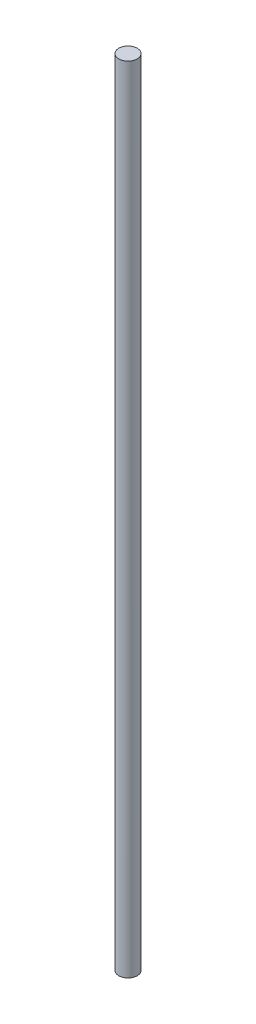
ISO-10303-21;
HEADER;
FILE_DESCRIPTION(('STEP AP214'),'2;1');
FILE_NAME('part.step','',(''),(''),'','','');
FILE_SCHEMA(('AUTOMOTIVE_DESIGN { 1 0 10303 214 1 1 1 1 }'));
ENDSEC;
DATA;
#1=APPLICATION_CONTEXT('core data for automotive mechanical design processes');
#2=APPLICATION_PROTOCOL_DEFINITION('international standard','automotive_design',2000,#1);
#3=PRODUCT_CONTEXT('',#1,'mechanical');
#4=PRODUCT('Part','Part','',(#3));
#5=PRODUCT_RELATED_PRODUCT_CATEGORY('part','',(#4));
#6=PRODUCT_DEFINITION_FORMATION('','',#4);
#7=PRODUCT_DEFINITION_CONTEXT('part definition',#1,'design');
#8=PRODUCT_DEFINITION('design','',#6,#7);
#9=PRODUCT_DEFINITION_SHAPE('','',#8);
#10=(LENGTH_UNIT() NAMED_UNIT(*) SI_UNIT(.MILLI.,.METRE.));
#11=(NAMED_UNIT(*) PLANE_ANGLE_UNIT() SI_UNIT($,.RADIAN.));
#12=(NAMED_UNIT(*) SI_UNIT($,.STERADIAN.) SOLID_ANGLE_UNIT());
#13=UNCERTAINTY_MEASURE_WITH_UNIT(LENGTH_MEASURE(1.E-05),#10,'distance_accuracy_value','');
#14=(GEOMETRIC_REPRESENTATION_CONTEXT(3) GLOBAL_UNCERTAINTY_ASSIGNED_CONTEXT((#13)) GLOBAL_UNIT_ASSIGNED_CONTEXT((#10,
#11,#12)) REPRESENTATION_CONTEXT('',''));
#15=CARTESIAN_POINT('',(0.,0.,0.));
#16=DIRECTION('',(0.,0.,1.));
#17=DIRECTION('',(1.,0.,0.));
#18=AXIS2_PLACEMENT_3D('',#15,#16,#17);
#19=CARTESIAN_POINT('',(0.,1481.0575773789,-760.214935882093));
#20=DIRECTION('',(0.,-1.,0.));
#21=DIRECTION('',(0.,0.,-1.));
#22=AXIS2_PLACEMENT_3D('',#19,#20,#21);
#23=CYLINDRICAL_SURFACE('',#22,12.2493401042905);
#24=CARTESIAN_POINT('',(0.,1481.0575773789,-760.214935882093));
#25=DIRECTION('',(0.,1.,0.));
#26=DIRECTION('',(0.,0.,1.));
#27=AXIS2_PLACEMENT_3D('',#24,#25,#26);
#28=CIRCLE('',#27,12.2493401042905);
#29=CARTESIAN_POINT('',(0.,1481.0575773789,-747.965595777802));
#30=VERTEX_POINT('',#29);
#31=EDGE_CURVE('E10',#30,#30,#28,.T.);
#32=ORIENTED_EDGE('',*,*,#31,.F.);
#33=EDGE_LOOP('',(#32));
#34=FACE_BOUND('',#33,.T.);
#35=CARTESIAN_POINT('',(0.,428.227577378897,-760.214935882093));
#36=DIRECTION('',(0.,-1.,0.));
#37=DIRECTION('',(0.,0.,-1.));
#38=AXIS2_PLACEMENT_3D('',#35,#36,#37);
#39=CIRCLE('',#38,12.2493401042905);
#40=CARTESIAN_POINT('',(0.,428.227577378897,-772.464275986383));
#41=VERTEX_POINT('',#40);
#42=EDGE_CURVE('E41',#41,#41,#39,.T.);
#43=ORIENTED_EDGE('',*,*,#42,.F.);
#44=EDGE_LOOP('',(#43));
#45=FACE_BOUND('',#44,.T.);
#46=ADVANCED_FACE('F35',(#34,#45),#23,.T.);
#47=CARTESIAN_POINT('',(0.,1481.0575773789,-760.214935882093));
#48=DIRECTION('',(0.,1.,0.));
#49=DIRECTION('',(0.,0.,1.));
#50=AXIS2_PLACEMENT_3D('',#47,#48,#49);
#51=PLANE('',#50);
#52=ORIENTED_EDGE('',*,*,#31,.T.);
#53=EDGE_LOOP('',(#52));
#54=FACE_BOUND('',#53,.T.);
#55=ADVANCED_FACE('F50',(#54),#51,.T.);
#56=CARTESIAN_POINT('',(0.,428.227577378897,-760.214935882093));
#57=DIRECTION('',(0.,-1.,0.));
#58=DIRECTION('',(0.,0.,-1.));
#59=AXIS2_PLACEMENT_3D('',#56,#57,#58);
#60=PLANE('',#59);
#61=ORIENTED_EDGE('',*,*,#42,.T.);
#62=EDGE_LOOP('',(#61));
#63=FACE_BOUND('',#62,.T.);
#64=ADVANCED_FACE('F47',(#63),#60,.T.);
#65=CLOSED_SHELL('',(#46,#55,#64));
#66=MANIFOLD_SOLID_BREP('B2',#65);
#67=ADVANCED_BREP_SHAPE_REPRESENTATION('',(#18,#66),#14);
#68=SHAPE_DEFINITION_REPRESENTATION(#9,#67);
ENDSEC;
END-ISO-10303-21;
